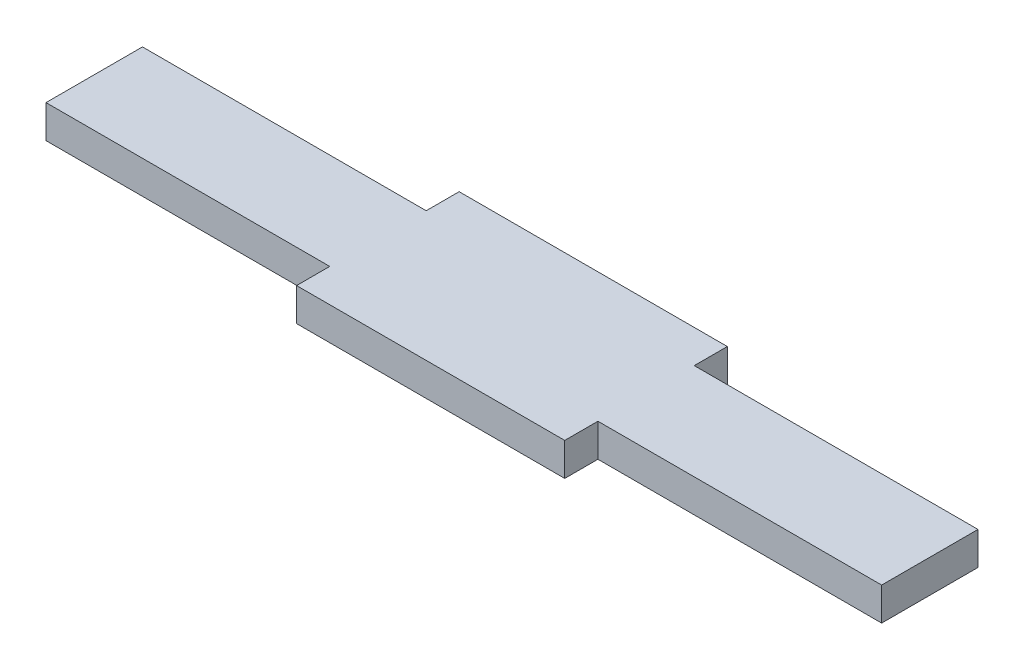
ISO-10303-21;
HEADER;
FILE_DESCRIPTION(('STEP AP214'),'2;1');
FILE_NAME('part.step','',(''),(''),'','','');
FILE_SCHEMA(('AUTOMOTIVE_DESIGN { 1 0 10303 214 1 1 1 1 }'));
ENDSEC;
DATA;
#1=APPLICATION_CONTEXT('core data for automotive mechanical design processes');
#2=APPLICATION_PROTOCOL_DEFINITION('international standard','automotive_design',2000,#1);
#3=PRODUCT_CONTEXT('',#1,'mechanical');
#4=PRODUCT('Part','Part','',(#3));
#5=PRODUCT_RELATED_PRODUCT_CATEGORY('part','',(#4));
#6=PRODUCT_DEFINITION_FORMATION('','',#4);
#7=PRODUCT_DEFINITION_CONTEXT('part definition',#1,'design');
#8=PRODUCT_DEFINITION('design','',#6,#7);
#9=PRODUCT_DEFINITION_SHAPE('','',#8);
#10=(LENGTH_UNIT() NAMED_UNIT(*) SI_UNIT(.MILLI.,.METRE.));
#11=(NAMED_UNIT(*) PLANE_ANGLE_UNIT() SI_UNIT($,.RADIAN.));
#12=(NAMED_UNIT(*) SI_UNIT($,.STERADIAN.) SOLID_ANGLE_UNIT());
#13=UNCERTAINTY_MEASURE_WITH_UNIT(LENGTH_MEASURE(1.E-05),#10,'distance_accuracy_value','');
#14=(GEOMETRIC_REPRESENTATION_CONTEXT(3) GLOBAL_UNCERTAINTY_ASSIGNED_CONTEXT((#13)) GLOBAL_UNIT_ASSIGNED_CONTEXT((#10,
#11,#12)) REPRESENTATION_CONTEXT('',''));
#15=CARTESIAN_POINT('',(0.,0.,0.));
#16=DIRECTION('',(0.,0.,1.));
#17=DIRECTION('',(1.,0.,0.));
#18=AXIS2_PLACEMENT_3D('',#15,#16,#17);
#19=CARTESIAN_POINT('',(-38.9199999999998,-218.79,8.97500000000001));
#20=DIRECTION('',(0.,0.,-1.));
#21=DIRECTION('',(-1.,0.,0.));
#22=AXIS2_PLACEMENT_3D('',#19,#20,#21);
#23=PLANE('',#22);
#24=DIRECTION('',(-1.,0.,0.));
#25=VECTOR('',#24,1.);
#26=CARTESIAN_POINT('',(-38.9199999999998,-221.86,8.97500000000001));
#27=LINE('',#26,#25);
#28=CARTESIAN_POINT('',(-12.4899999999999,-221.86,8.97500000000001));
#29=VERTEX_POINT('',#28);
#30=CARTESIAN_POINT('',(-38.9199999999998,-221.86,8.97500000000001));
#31=VERTEX_POINT('',#30);
#32=EDGE_CURVE('E163',#29,#31,#27,.T.);
#33=ORIENTED_EDGE('',*,*,#32,.F.);
#34=DIRECTION('',(0.,-1.,0.));
#35=VECTOR('',#34,1.);
#36=CARTESIAN_POINT('',(-12.4899999999999,-218.79,8.97500000000001));
#37=LINE('',#36,#35);
#38=CARTESIAN_POINT('',(-12.4899999999999,-218.79,8.97500000000001));
#39=VERTEX_POINT('',#38);
#40=EDGE_CURVE('E162',#39,#29,#37,.T.);
#41=ORIENTED_EDGE('',*,*,#40,.F.);
#42=DIRECTION('',(-1.,0.,0.));
#43=VECTOR('',#42,1.);
#44=CARTESIAN_POINT('',(-38.9199999999998,-218.79,8.97500000000001));
#45=LINE('',#44,#43);
#46=CARTESIAN_POINT('',(-38.9199999999998,-218.79,8.97500000000001));
#47=VERTEX_POINT('',#46);
#48=EDGE_CURVE('E193',#39,#47,#45,.T.);
#49=ORIENTED_EDGE('',*,*,#48,.T.);
#50=DIRECTION('',(0.,-1.,0.));
#51=VECTOR('',#50,1.);
#52=CARTESIAN_POINT('',(-38.9199999999998,-218.79,8.97500000000001));
#53=LINE('',#52,#51);
#54=EDGE_CURVE('E11',#47,#31,#53,.T.);
#55=ORIENTED_EDGE('',*,*,#54,.T.);
#56=EDGE_LOOP('',(#33,#41,#49,#55));
#57=FACE_BOUND('',#56,.T.);
#58=ADVANCED_FACE('F43',(#57),#23,.F.);
#59=CARTESIAN_POINT('',(-38.9199999999998,-218.79,-0.0100000000000037));
#60=DIRECTION('',(1.,0.,0.));
#61=DIRECTION('',(0.,0.,-1.));
#62=AXIS2_PLACEMENT_3D('',#59,#60,#61);
#63=PLANE('',#62);
#64=DIRECTION('',(0.,0.,-1.));
#65=VECTOR('',#64,1.);
#66=CARTESIAN_POINT('',(-38.9199999999998,-221.86,-0.0100000000000037));
#67=LINE('',#66,#65);
#68=CARTESIAN_POINT('',(-38.9199999999998,-221.86,-0.0100000000000037));
#69=VERTEX_POINT('',#68);
#70=EDGE_CURVE('E165',#31,#69,#67,.T.);
#71=ORIENTED_EDGE('',*,*,#70,.F.);
#72=ORIENTED_EDGE('',*,*,#54,.F.);
#73=DIRECTION('',(0.,0.,-1.));
#74=VECTOR('',#73,1.);
#75=CARTESIAN_POINT('',(-38.9199999999998,-218.79,-0.0100000000000037));
#76=LINE('',#75,#74);
#77=CARTESIAN_POINT('',(-38.9199999999998,-218.79,-0.0100000000000037));
#78=VERTEX_POINT('',#77);
#79=EDGE_CURVE('E109',#47,#78,#76,.T.);
#80=ORIENTED_EDGE('',*,*,#79,.T.);
#81=DIRECTION('',(0.,-1.,0.));
#82=VECTOR('',#81,1.);
#83=CARTESIAN_POINT('',(-38.9199999999998,-218.79,-0.0100000000000037));
#84=LINE('',#83,#82);
#85=EDGE_CURVE('E51',#78,#69,#84,.T.);
#86=ORIENTED_EDGE('',*,*,#85,.T.);
#87=EDGE_LOOP('',(#71,#72,#80,#86));
#88=FACE_BOUND('',#87,.T.);
#89=ADVANCED_FACE('F217',(#88),#63,.F.);
#90=CARTESIAN_POINT('',(-12.4899999999999,-218.79,-0.0100000000000005));
#91=DIRECTION('',(0.,0.,1.));
#92=DIRECTION('',(1.,0.,0.));
#93=AXIS2_PLACEMENT_3D('',#90,#91,#92);
#94=PLANE('',#93);
#95=DIRECTION('',(1.,0.,0.));
#96=VECTOR('',#95,1.);
#97=CARTESIAN_POINT('',(-12.4899999999999,-221.86,-0.0100000000000005));
#98=LINE('',#97,#96);
#99=CARTESIAN_POINT('',(-12.4899999999999,-221.86,-0.0100000000000005));
#100=VERTEX_POINT('',#99);
#101=EDGE_CURVE('E168',#69,#100,#98,.T.);
#102=ORIENTED_EDGE('',*,*,#101,.F.);
#103=ORIENTED_EDGE('',*,*,#85,.F.);
#104=DIRECTION('',(1.,0.,0.));
#105=VECTOR('',#104,1.);
#106=CARTESIAN_POINT('',(-12.4899999999999,-218.79,-0.0100000000000005));
#107=LINE('',#106,#105);
#108=CARTESIAN_POINT('',(-12.4899999999999,-218.79,-0.0100000000000005));
#109=VERTEX_POINT('',#108);
#110=EDGE_CURVE('E226',#78,#109,#107,.T.);
#111=ORIENTED_EDGE('',*,*,#110,.T.);
#112=DIRECTION('',(0.,-1.,0.));
#113=VECTOR('',#112,1.);
#114=CARTESIAN_POINT('',(-12.4899999999999,-218.79,-0.0100000000000005));
#115=LINE('',#114,#113);
#116=EDGE_CURVE('E212',#109,#100,#115,.T.);
#117=ORIENTED_EDGE('',*,*,#116,.T.);
#118=EDGE_LOOP('',(#102,#103,#111,#117));
#119=FACE_BOUND('',#118,.T.);
#120=ADVANCED_FACE('F260',(#119),#94,.F.);
#121=CARTESIAN_POINT('',(-12.4899999999999,-218.79,-3.08));
#122=DIRECTION('',(1.,0.,0.));
#123=DIRECTION('',(0.,0.,-1.));
#124=AXIS2_PLACEMENT_3D('',#121,#122,#123);
#125=PLANE('',#124);
#126=DIRECTION('',(0.,0.,-1.));
#127=VECTOR('',#126,1.);
#128=CARTESIAN_POINT('',(-12.4899999999999,-221.86,-3.08));
#129=LINE('',#128,#127);
#130=CARTESIAN_POINT('',(-12.4899999999999,-221.86,-3.08));
#131=VERTEX_POINT('',#130);
#132=EDGE_CURVE('E171',#100,#131,#129,.T.);
#133=ORIENTED_EDGE('',*,*,#132,.F.);
#134=ORIENTED_EDGE('',*,*,#116,.F.);
#135=DIRECTION('',(0.,0.,-1.));
#136=VECTOR('',#135,1.);
#137=CARTESIAN_POINT('',(-12.4899999999999,-218.79,-3.08));
#138=LINE('',#137,#136);
#139=CARTESIAN_POINT('',(-12.4899999999999,-218.79,-3.08));
#140=VERTEX_POINT('',#139);
#141=EDGE_CURVE('E230',#109,#140,#138,.T.);
#142=ORIENTED_EDGE('',*,*,#141,.T.);
#143=DIRECTION('',(0.,-1.,0.));
#144=VECTOR('',#143,1.);
#145=CARTESIAN_POINT('',(-12.4899999999999,-218.79,-3.08));
#146=LINE('',#145,#144);
#147=EDGE_CURVE('E209',#140,#131,#146,.T.);
#148=ORIENTED_EDGE('',*,*,#147,.T.);
#149=EDGE_LOOP('',(#133,#134,#142,#148));
#150=FACE_BOUND('',#149,.T.);
#151=ADVANCED_FACE('F259',(#150),#125,.F.);
#152=CARTESIAN_POINT('',(12.4900000000001,-218.79,-3.08));
#153=DIRECTION('',(0.,0.,1.));
#154=DIRECTION('',(1.,0.,0.));
#155=AXIS2_PLACEMENT_3D('',#152,#153,#154);
#156=PLANE('',#155);
#157=DIRECTION('',(1.,0.,0.));
#158=VECTOR('',#157,1.);
#159=CARTESIAN_POINT('',(12.4900000000001,-221.86,-3.08));
#160=LINE('',#159,#158);
#161=CARTESIAN_POINT('',(12.4900000000001,-221.86,-3.08));
#162=VERTEX_POINT('',#161);
#163=EDGE_CURVE('E174',#131,#162,#160,.T.);
#164=ORIENTED_EDGE('',*,*,#163,.F.);
#165=ORIENTED_EDGE('',*,*,#147,.F.);
#166=DIRECTION('',(1.,0.,0.));
#167=VECTOR('',#166,1.);
#168=CARTESIAN_POINT('',(12.4900000000001,-218.79,-3.08));
#169=LINE('',#168,#167);
#170=CARTESIAN_POINT('',(12.4900000000001,-218.79,-3.08));
#171=VERTEX_POINT('',#170);
#172=EDGE_CURVE('E233',#140,#171,#169,.T.);
#173=ORIENTED_EDGE('',*,*,#172,.T.);
#174=DIRECTION('',(0.,-1.,0.));
#175=VECTOR('',#174,1.);
#176=CARTESIAN_POINT('',(12.4900000000001,-218.79,-3.08));
#177=LINE('',#176,#175);
#178=EDGE_CURVE('E206',#171,#162,#177,.T.);
#179=ORIENTED_EDGE('',*,*,#178,.T.);
#180=EDGE_LOOP('',(#164,#165,#173,#179));
#181=FACE_BOUND('',#180,.T.);
#182=ADVANCED_FACE('F257',(#181),#156,.F.);
#183=CARTESIAN_POINT('',(12.4900000000001,-218.79,0.));
#184=DIRECTION('',(-1.,0.,0.));
#185=DIRECTION('',(0.,0.,1.));
#186=AXIS2_PLACEMENT_3D('',#183,#184,#185);
#187=PLANE('',#186);
#188=DIRECTION('',(0.,0.,1.));
#189=VECTOR('',#188,1.);
#190=CARTESIAN_POINT('',(12.4900000000001,-221.86,0.));
#191=LINE('',#190,#189);
#192=CARTESIAN_POINT('',(12.4900000000001,-221.86,0.));
#193=VERTEX_POINT('',#192);
#194=EDGE_CURVE('E177',#162,#193,#191,.T.);
#195=ORIENTED_EDGE('',*,*,#194,.F.);
#196=ORIENTED_EDGE('',*,*,#178,.F.);
#197=DIRECTION('',(0.,0.,1.));
#198=VECTOR('',#197,1.);
#199=CARTESIAN_POINT('',(12.4900000000001,-218.79,0.));
#200=LINE('',#199,#198);
#201=CARTESIAN_POINT('',(12.4900000000001,-218.79,0.));
#202=VERTEX_POINT('',#201);
#203=EDGE_CURVE('E236',#171,#202,#200,.T.);
#204=ORIENTED_EDGE('',*,*,#203,.T.);
#205=DIRECTION('',(0.,-1.,0.));
#206=VECTOR('',#205,1.);
#207=CARTESIAN_POINT('',(12.4900000000001,-218.79,0.));
#208=LINE('',#207,#206);
#209=EDGE_CURVE('E203',#202,#193,#208,.T.);
#210=ORIENTED_EDGE('',*,*,#209,.T.);
#211=EDGE_LOOP('',(#195,#196,#204,#210));
#212=FACE_BOUND('',#211,.T.);
#213=ADVANCED_FACE('F253',(#212),#187,.F.);
#214=CARTESIAN_POINT('',(38.92,-218.79,0.));
#215=DIRECTION('',(0.,0.,1.));
#216=DIRECTION('',(1.,0.,0.));
#217=AXIS2_PLACEMENT_3D('',#214,#215,#216);
#218=PLANE('',#217);
#219=DIRECTION('',(1.,0.,0.));
#220=VECTOR('',#219,1.);
#221=CARTESIAN_POINT('',(38.92,-221.86,0.));
#222=LINE('',#221,#220);
#223=CARTESIAN_POINT('',(38.92,-221.86,0.));
#224=VERTEX_POINT('',#223);
#225=EDGE_CURVE('E180',#193,#224,#222,.T.);
#226=ORIENTED_EDGE('',*,*,#225,.F.);
#227=ORIENTED_EDGE('',*,*,#209,.F.);
#228=DIRECTION('',(1.,0.,0.));
#229=VECTOR('',#228,1.);
#230=CARTESIAN_POINT('',(38.92,-218.79,0.));
#231=LINE('',#230,#229);
#232=CARTESIAN_POINT('',(38.92,-218.79,0.));
#233=VERTEX_POINT('',#232);
#234=EDGE_CURVE('E239',#202,#233,#231,.T.);
#235=ORIENTED_EDGE('',*,*,#234,.T.);
#236=DIRECTION('',(0.,-1.,0.));
#237=VECTOR('',#236,1.);
#238=CARTESIAN_POINT('',(38.92,-218.79,0.));
#239=LINE('',#238,#237);
#240=EDGE_CURVE('E200',#233,#224,#239,.T.);
#241=ORIENTED_EDGE('',*,*,#240,.T.);
#242=EDGE_LOOP('',(#226,#227,#235,#241));
#243=FACE_BOUND('',#242,.T.);
#244=ADVANCED_FACE('F250',(#243),#218,.F.);
#245=CARTESIAN_POINT('',(38.92,-218.79,8.97500000000001));
#246=DIRECTION('',(-1.,0.,0.));
#247=DIRECTION('',(0.,0.,1.));
#248=AXIS2_PLACEMENT_3D('',#245,#246,#247);
#249=PLANE('',#248);
#250=DIRECTION('',(0.,0.,1.));
#251=VECTOR('',#250,1.);
#252=CARTESIAN_POINT('',(38.92,-221.86,8.97500000000001));
#253=LINE('',#252,#251);
#254=CARTESIAN_POINT('',(38.92,-221.86,8.97500000000001));
#255=VERTEX_POINT('',#254);
#256=EDGE_CURVE('E183',#224,#255,#253,.T.);
#257=ORIENTED_EDGE('',*,*,#256,.F.);
#258=ORIENTED_EDGE('',*,*,#240,.F.);
#259=DIRECTION('',(0.,0.,1.));
#260=VECTOR('',#259,1.);
#261=CARTESIAN_POINT('',(38.92,-218.79,8.97500000000001));
#262=LINE('',#261,#260);
#263=CARTESIAN_POINT('',(38.92,-218.79,8.97500000000001));
#264=VERTEX_POINT('',#263);
#265=EDGE_CURVE('E157',#233,#264,#262,.T.);
#266=ORIENTED_EDGE('',*,*,#265,.T.);
#267=DIRECTION('',(0.,-1.,0.));
#268=VECTOR('',#267,1.);
#269=CARTESIAN_POINT('',(38.92,-218.79,8.97500000000001));
#270=LINE('',#269,#268);
#271=EDGE_CURVE('E197',#264,#255,#270,.T.);
#272=ORIENTED_EDGE('',*,*,#271,.T.);
#273=EDGE_LOOP('',(#257,#258,#266,#272));
#274=FACE_BOUND('',#273,.T.);
#275=ADVANCED_FACE('F244',(#274),#249,.F.);
#276=CARTESIAN_POINT('',(12.4900000000001,-218.79,8.97500000000001));
#277=DIRECTION('',(0.,0.,-1.));
#278=DIRECTION('',(-1.,0.,0.));
#279=AXIS2_PLACEMENT_3D('',#276,#277,#278);
#280=PLANE('',#279);
#281=DIRECTION('',(-1.,0.,0.));
#282=VECTOR('',#281,1.);
#283=CARTESIAN_POINT('',(12.4900000000001,-221.86,8.97500000000001));
#284=LINE('',#283,#282);
#285=CARTESIAN_POINT('',(12.4900000000001,-221.86,8.97500000000001));
#286=VERTEX_POINT('',#285);
#287=EDGE_CURVE('E186',#255,#286,#284,.T.);
#288=ORIENTED_EDGE('',*,*,#287,.F.);
#289=ORIENTED_EDGE('',*,*,#271,.F.);
#290=DIRECTION('',(-1.,0.,0.));
#291=VECTOR('',#290,1.);
#292=CARTESIAN_POINT('',(12.4900000000001,-218.79,8.97500000000001));
#293=LINE('',#292,#291);
#294=CARTESIAN_POINT('',(12.4900000000001,-218.79,8.97500000000001));
#295=VERTEX_POINT('',#294);
#296=EDGE_CURVE('E155',#264,#295,#293,.T.);
#297=ORIENTED_EDGE('',*,*,#296,.T.);
#298=DIRECTION('',(0.,-1.,0.));
#299=VECTOR('',#298,1.);
#300=CARTESIAN_POINT('',(12.4900000000001,-218.79,8.97500000000001));
#301=LINE('',#300,#299);
#302=EDGE_CURVE('E149',#295,#286,#301,.T.);
#303=ORIENTED_EDGE('',*,*,#302,.T.);
#304=EDGE_LOOP('',(#288,#289,#297,#303));
#305=FACE_BOUND('',#304,.T.);
#306=ADVANCED_FACE('F248',(#305),#280,.F.);
#307=CARTESIAN_POINT('',(12.4900000000001,-218.79,12.065));
#308=DIRECTION('',(-1.,0.,0.));
#309=DIRECTION('',(0.,0.,1.));
#310=AXIS2_PLACEMENT_3D('',#307,#308,#309);
#311=PLANE('',#310);
#312=DIRECTION('',(0.,0.,1.));
#313=VECTOR('',#312,1.);
#314=CARTESIAN_POINT('',(12.4900000000001,-221.86,12.065));
#315=LINE('',#314,#313);
#316=CARTESIAN_POINT('',(12.4900000000001,-221.86,12.065));
#317=VERTEX_POINT('',#316);
#318=EDGE_CURVE('E189',#286,#317,#315,.T.);
#319=ORIENTED_EDGE('',*,*,#318,.F.);
#320=ORIENTED_EDGE('',*,*,#302,.F.);
#321=DIRECTION('',(0.,0.,1.));
#322=VECTOR('',#321,1.);
#323=CARTESIAN_POINT('',(12.4900000000001,-218.79,12.065));
#324=LINE('',#323,#322);
#325=CARTESIAN_POINT('',(12.4900000000001,-218.79,12.065));
#326=VERTEX_POINT('',#325);
#327=EDGE_CURVE('E139',#295,#326,#324,.T.);
#328=ORIENTED_EDGE('',*,*,#327,.T.);
#329=DIRECTION('',(0.,-1.,0.));
#330=VECTOR('',#329,1.);
#331=CARTESIAN_POINT('',(12.4900000000001,-218.79,12.065));
#332=LINE('',#331,#330);
#333=EDGE_CURVE('E144',#326,#317,#332,.T.);
#334=ORIENTED_EDGE('',*,*,#333,.T.);
#335=EDGE_LOOP('',(#319,#320,#328,#334));
#336=FACE_BOUND('',#335,.T.);
#337=ADVANCED_FACE('F152',(#336),#311,.F.);
#338=CARTESIAN_POINT('',(-12.4899999999999,-218.79,12.065));
#339=DIRECTION('',(0.,0.,-1.));
#340=DIRECTION('',(-1.,0.,0.));
#341=AXIS2_PLACEMENT_3D('',#338,#339,#340);
#342=PLANE('',#341);
#343=DIRECTION('',(-1.,0.,0.));
#344=VECTOR('',#343,1.);
#345=CARTESIAN_POINT('',(-12.4899999999999,-221.86,12.065));
#346=LINE('',#345,#344);
#347=CARTESIAN_POINT('',(-12.4899999999999,-221.86,12.065));
#348=VERTEX_POINT('',#347);
#349=EDGE_CURVE('E146',#317,#348,#346,.T.);
#350=ORIENTED_EDGE('',*,*,#349,.F.);
#351=ORIENTED_EDGE('',*,*,#333,.F.);
#352=DIRECTION('',(-1.,0.,0.));
#353=VECTOR('',#352,1.);
#354=CARTESIAN_POINT('',(-12.4899999999999,-218.79,12.065));
#355=LINE('',#354,#353);
#356=CARTESIAN_POINT('',(-12.4899999999999,-218.79,12.065));
#357=VERTEX_POINT('',#356);
#358=EDGE_CURVE('E135',#326,#357,#355,.T.);
#359=ORIENTED_EDGE('',*,*,#358,.T.);
#360=DIRECTION('',(0.,-1.,0.));
#361=VECTOR('',#360,1.);
#362=CARTESIAN_POINT('',(-12.4899999999999,-218.79,12.065));
#363=LINE('',#362,#361);
#364=EDGE_CURVE('E150',#357,#348,#363,.T.);
#365=ORIENTED_EDGE('',*,*,#364,.T.);
#366=EDGE_LOOP('',(#350,#351,#359,#365));
#367=FACE_BOUND('',#366,.T.);
#368=ADVANCED_FACE('F145',(#367),#342,.F.);
#369=CARTESIAN_POINT('',(-12.4899999999999,-218.79,8.97500000000001));
#370=DIRECTION('',(1.,0.,0.));
#371=DIRECTION('',(0.,0.,-1.));
#372=AXIS2_PLACEMENT_3D('',#369,#370,#371);
#373=PLANE('',#372);
#374=DIRECTION('',(0.,0.,-1.));
#375=VECTOR('',#374,1.);
#376=CARTESIAN_POINT('',(-12.4899999999999,-221.86,8.97500000000001));
#377=LINE('',#376,#375);
#378=EDGE_CURVE('E97',#348,#29,#377,.T.);
#379=ORIENTED_EDGE('',*,*,#378,.F.);
#380=ORIENTED_EDGE('',*,*,#364,.F.);
#381=DIRECTION('',(0.,0.,-1.));
#382=VECTOR('',#381,1.);
#383=CARTESIAN_POINT('',(-12.4899999999999,-218.79,8.97500000000001));
#384=LINE('',#383,#382);
#385=EDGE_CURVE('E59',#357,#39,#384,.T.);
#386=ORIENTED_EDGE('',*,*,#385,.T.);
#387=ORIENTED_EDGE('',*,*,#40,.T.);
#388=EDGE_LOOP('',(#379,#380,#386,#387));
#389=FACE_BOUND('',#388,.T.);
#390=ADVANCED_FACE('F337',(#389),#373,.F.);
#391=CARTESIAN_POINT('',(0.,-218.79,0.));
#392=DIRECTION('',(0.,1.,0.));
#393=DIRECTION('',(0.,0.,-1.));
#394=AXIS2_PLACEMENT_3D('',#391,#392,#393);
#395=PLANE('',#394);
#396=ORIENTED_EDGE('',*,*,#48,.F.);
#397=ORIENTED_EDGE('',*,*,#385,.F.);
#398=ORIENTED_EDGE('',*,*,#358,.F.);
#399=ORIENTED_EDGE('',*,*,#327,.F.);
#400=ORIENTED_EDGE('',*,*,#296,.F.);
#401=ORIENTED_EDGE('',*,*,#265,.F.);
#402=ORIENTED_EDGE('',*,*,#234,.F.);
#403=ORIENTED_EDGE('',*,*,#203,.F.);
#404=ORIENTED_EDGE('',*,*,#172,.F.);
#405=ORIENTED_EDGE('',*,*,#141,.F.);
#406=ORIENTED_EDGE('',*,*,#110,.F.);
#407=ORIENTED_EDGE('',*,*,#79,.F.);
#408=EDGE_LOOP('',(#396,#397,#398,#399,#400,#401,#402,#403,#404,#405,#406,#407));
#409=FACE_BOUND('',#408,.T.);
#410=ADVANCED_FACE('F137',(#409),#395,.T.);
#411=CARTESIAN_POINT('',(0.,-221.86,0.));
#412=DIRECTION('',(0.,1.,0.));
#413=DIRECTION('',(0.,0.,-1.));
#414=AXIS2_PLACEMENT_3D('',#411,#412,#413);
#415=PLANE('',#414);
#416=ORIENTED_EDGE('',*,*,#32,.T.);
#417=ORIENTED_EDGE('',*,*,#70,.T.);
#418=ORIENTED_EDGE('',*,*,#101,.T.);
#419=ORIENTED_EDGE('',*,*,#132,.T.);
#420=ORIENTED_EDGE('',*,*,#163,.T.);
#421=ORIENTED_EDGE('',*,*,#194,.T.);
#422=ORIENTED_EDGE('',*,*,#225,.T.);
#423=ORIENTED_EDGE('',*,*,#256,.T.);
#424=ORIENTED_EDGE('',*,*,#287,.T.);
#425=ORIENTED_EDGE('',*,*,#318,.T.);
#426=ORIENTED_EDGE('',*,*,#349,.T.);
#427=ORIENTED_EDGE('',*,*,#378,.T.);
#428=EDGE_LOOP('',(#416,#417,#418,#419,#420,#421,#422,#423,#424,#425,#426,#427));
#429=FACE_BOUND('',#428,.T.);
#430=ADVANCED_FACE('F220',(#429),#415,.F.);
#431=CLOSED_SHELL('',(#58,#89,#120,#151,#182,#213,#244,#275,#306,#337,#368,#390,#410,#430));
#432=MANIFOLD_SOLID_BREP('B2',#431);
#433=ADVANCED_BREP_SHAPE_REPRESENTATION('',(#18,#432),#14);
#434=SHAPE_DEFINITION_REPRESENTATION(#9,#433);
ENDSEC;
END-ISO-10303-21;
